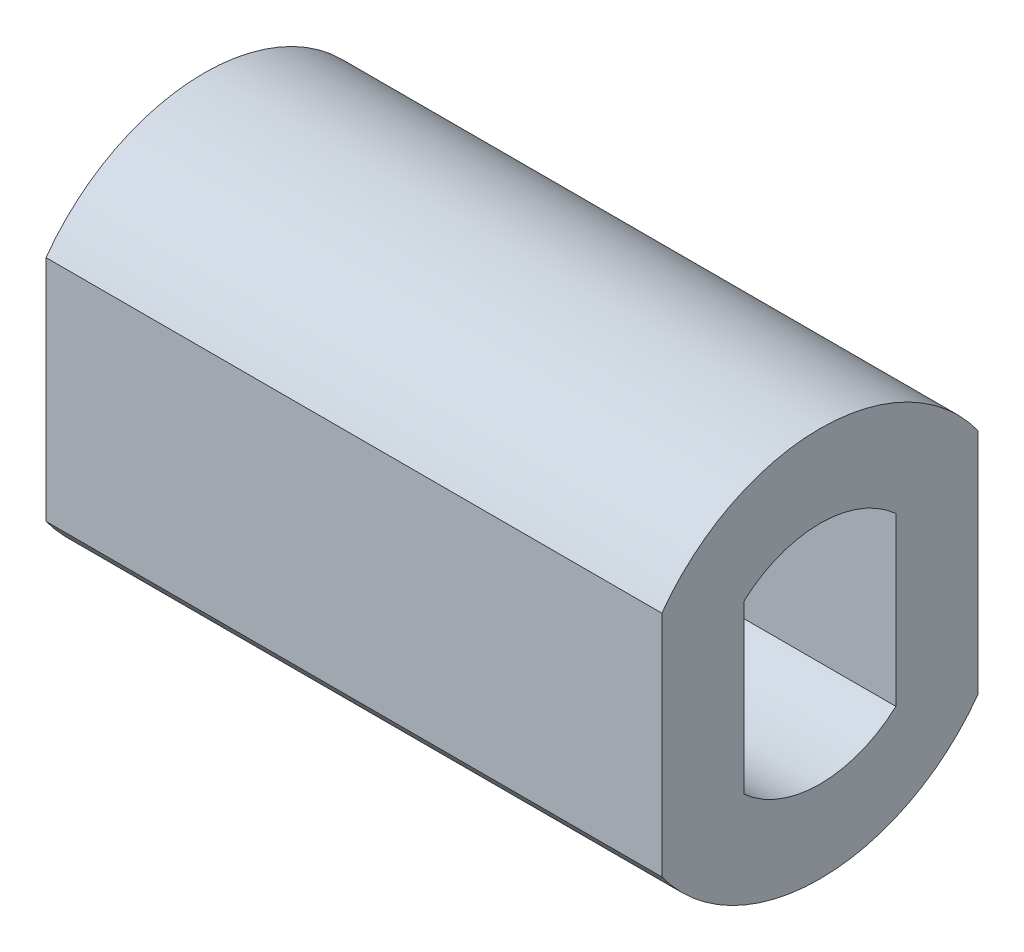
ISO-10303-21;
HEADER;
FILE_DESCRIPTION(('STEP AP214'),'2;1');
FILE_NAME('part.step','',(''),(''),'','','');
FILE_SCHEMA(('AUTOMOTIVE_DESIGN { 1 0 10303 214 1 1 1 1 }'));
ENDSEC;
DATA;
#1=APPLICATION_CONTEXT('core data for automotive mechanical design processes');
#2=APPLICATION_PROTOCOL_DEFINITION('international standard','automotive_design',2000,#1);
#3=PRODUCT_CONTEXT('',#1,'mechanical');
#4=PRODUCT('Part','Part','',(#3));
#5=PRODUCT_RELATED_PRODUCT_CATEGORY('part','',(#4));
#6=PRODUCT_DEFINITION_FORMATION('','',#4);
#7=PRODUCT_DEFINITION_CONTEXT('part definition',#1,'design');
#8=PRODUCT_DEFINITION('design','',#6,#7);
#9=PRODUCT_DEFINITION_SHAPE('','',#8);
#10=(LENGTH_UNIT() NAMED_UNIT(*) SI_UNIT(.MILLI.,.METRE.));
#11=(NAMED_UNIT(*) PLANE_ANGLE_UNIT() SI_UNIT($,.RADIAN.));
#12=(NAMED_UNIT(*) SI_UNIT($,.STERADIAN.) SOLID_ANGLE_UNIT());
#13=UNCERTAINTY_MEASURE_WITH_UNIT(LENGTH_MEASURE(1.E-05),#10,'distance_accuracy_value','');
#14=(GEOMETRIC_REPRESENTATION_CONTEXT(3) GLOBAL_UNCERTAINTY_ASSIGNED_CONTEXT((#13)) GLOBAL_UNIT_ASSIGNED_CONTEXT((#10,
#11,#12)) REPRESENTATION_CONTEXT('',''));
#15=CARTESIAN_POINT('',(0.,0.,0.));
#16=DIRECTION('',(0.,0.,1.));
#17=DIRECTION('',(1.,0.,0.));
#18=AXIS2_PLACEMENT_3D('',#15,#16,#17);
#19=CARTESIAN_POINT('',(20.,0.,0.));
#20=DIRECTION('',(1.,0.,0.));
#21=DIRECTION('',(0.,0.,-1.));
#22=AXIS2_PLACEMENT_3D('',#19,#20,#21);
#23=PLANE('',#22);
#24=CARTESIAN_POINT('',(20.,0.,0.));
#25=DIRECTION('',(1.,0.,0.));
#26=DIRECTION('',(0.,0.,-1.));
#27=AXIS2_PLACEMENT_3D('',#24,#25,#26);
#28=CIRCLE('',#27,4.75);
#29=CARTESIAN_POINT('',(20.,2.78208554864871,-3.85));
#30=VERTEX_POINT('',#29);
#31=CARTESIAN_POINT('',(20.,2.78208554864871,3.85));
#32=VERTEX_POINT('',#31);
#33=EDGE_CURVE('E166',#30,#32,#28,.T.);
#34=ORIENTED_EDGE('',*,*,#33,.T.);
#35=DIRECTION('',(0.,-1.,0.));
#36=VECTOR('',#35,1.);
#37=CARTESIAN_POINT('',(20.,2.78208554864871,3.85));
#38=LINE('',#37,#36);
#39=CARTESIAN_POINT('',(20.,-2.78208554864871,3.85));
#40=VERTEX_POINT('',#39);
#41=EDGE_CURVE('E169',#32,#40,#38,.T.);
#42=ORIENTED_EDGE('',*,*,#41,.T.);
#43=CARTESIAN_POINT('',(20.,0.,0.));
#44=DIRECTION('',(1.,0.,0.));
#45=DIRECTION('',(0.,0.,-1.));
#46=AXIS2_PLACEMENT_3D('',#43,#44,#45);
#47=CIRCLE('',#46,4.75);
#48=CARTESIAN_POINT('',(20.,-2.78208554864871,-3.85));
#49=VERTEX_POINT('',#48);
#50=EDGE_CURVE('E171',#40,#49,#47,.T.);
#51=ORIENTED_EDGE('',*,*,#50,.T.);
#52=DIRECTION('',(0.,1.,0.));
#53=VECTOR('',#52,1.);
#54=CARTESIAN_POINT('',(20.,-2.78208554864871,-3.85));
#55=LINE('',#54,#53);
#56=EDGE_CURVE('E173',#49,#30,#55,.T.);
#57=ORIENTED_EDGE('',*,*,#56,.T.);
#58=EDGE_LOOP('',(#34,#42,#51,#57));
#59=FACE_BOUND('',#58,.T.);
#60=DIRECTION('',(0.,-1.,0.));
#61=VECTOR('',#60,1.);
#62=CARTESIAN_POINT('',(20.,2.03469899493758,1.85));
#63=LINE('',#62,#61);
#64=CARTESIAN_POINT('',(20.,2.03469899493758,1.85));
#65=VERTEX_POINT('',#64);
#66=CARTESIAN_POINT('',(20.,-2.03469899493758,1.85));
#67=VERTEX_POINT('',#66);
#68=EDGE_CURVE('E147',#65,#67,#63,.T.);
#69=ORIENTED_EDGE('',*,*,#68,.F.);
#70=CARTESIAN_POINT('',(20.,0.,0.));
#71=DIRECTION('',(1.,0.,0.));
#72=DIRECTION('',(0.,0.,-1.));
#73=AXIS2_PLACEMENT_3D('',#70,#71,#72);
#74=CIRCLE('',#73,2.75);
#75=CARTESIAN_POINT('',(20.,2.03469899493758,-1.85));
#76=VERTEX_POINT('',#75);
#77=EDGE_CURVE('E119',#76,#65,#74,.T.);
#78=ORIENTED_EDGE('',*,*,#77,.F.);
#79=DIRECTION('',(0.,1.,0.));
#80=VECTOR('',#79,1.);
#81=CARTESIAN_POINT('',(20.,-2.03469899493758,-1.85));
#82=LINE('',#81,#80);
#83=CARTESIAN_POINT('',(20.,-2.03469899493758,-1.85));
#84=VERTEX_POINT('',#83);
#85=EDGE_CURVE('E152',#84,#76,#82,.T.);
#86=ORIENTED_EDGE('',*,*,#85,.F.);
#87=CARTESIAN_POINT('',(20.,0.,0.));
#88=DIRECTION('',(1.,0.,0.));
#89=DIRECTION('',(0.,0.,-1.));
#90=AXIS2_PLACEMENT_3D('',#87,#88,#89);
#91=CIRCLE('',#90,2.75);
#92=EDGE_CURVE('E149',#67,#84,#91,.T.);
#93=ORIENTED_EDGE('',*,*,#92,.F.);
#94=EDGE_LOOP('',(#69,#78,#86,#93));
#95=FACE_BOUND('',#94,.T.);
#96=ADVANCED_FACE('F34',(#59,#95),#23,.T.);
#97=CARTESIAN_POINT('',(20.,0.,0.));
#98=DIRECTION('',(-1.,0.,0.));
#99=DIRECTION('',(0.,0.,1.));
#100=AXIS2_PLACEMENT_3D('',#97,#98,#99);
#101=CYLINDRICAL_SURFACE('',#100,4.75);
#102=DIRECTION('',(-1.,0.,0.));
#103=VECTOR('',#102,1.);
#104=CARTESIAN_POINT('',(20.,2.78208554864871,-3.85));
#105=LINE('',#104,#103);
#106=CARTESIAN_POINT('',(5.,2.78208554864871,-3.85));
#107=VERTEX_POINT('',#106);
#108=EDGE_CURVE('E175',#30,#107,#105,.T.);
#109=ORIENTED_EDGE('',*,*,#108,.T.);
#110=CARTESIAN_POINT('',(5.,0.,0.));
#111=DIRECTION('',(-1.,0.,0.));
#112=DIRECTION('',(0.,0.,1.));
#113=AXIS2_PLACEMENT_3D('',#110,#111,#112);
#114=CIRCLE('',#113,4.75);
#115=CARTESIAN_POINT('',(5.,2.78208554864871,3.85));
#116=VERTEX_POINT('',#115);
#117=EDGE_CURVE('E132',#116,#107,#114,.T.);
#118=ORIENTED_EDGE('',*,*,#117,.F.);
#119=DIRECTION('',(-1.,0.,0.));
#120=VECTOR('',#119,1.);
#121=CARTESIAN_POINT('',(20.,2.78208554864871,3.85));
#122=LINE('',#121,#120);
#123=EDGE_CURVE('E181',#32,#116,#122,.T.);
#124=ORIENTED_EDGE('',*,*,#123,.F.);
#125=ORIENTED_EDGE('',*,*,#33,.F.);
#126=EDGE_LOOP('',(#109,#118,#124,#125));
#127=FACE_BOUND('',#126,.T.);
#128=ADVANCED_FACE('F208',(#127),#101,.T.);
#129=CARTESIAN_POINT('',(20.,2.78208554864871,3.85));
#130=DIRECTION('',(0.,0.,-1.));
#131=DIRECTION('',(0.,1.,0.));
#132=AXIS2_PLACEMENT_3D('',#129,#130,#131);
#133=PLANE('',#132);
#134=ORIENTED_EDGE('',*,*,#123,.T.);
#135=DIRECTION('',(0.,1.,0.));
#136=VECTOR('',#135,1.);
#137=CARTESIAN_POINT('',(5.,0.,3.85));
#138=LINE('',#137,#136);
#139=CARTESIAN_POINT('',(5.,-2.78208554864871,3.85));
#140=VERTEX_POINT('',#139);
#141=EDGE_CURVE('E129',#140,#116,#138,.T.);
#142=ORIENTED_EDGE('',*,*,#141,.F.);
#143=DIRECTION('',(-1.,0.,0.));
#144=VECTOR('',#143,1.);
#145=CARTESIAN_POINT('',(20.,-2.78208554864871,3.85));
#146=LINE('',#145,#144);
#147=EDGE_CURVE('E179',#40,#140,#146,.T.);
#148=ORIENTED_EDGE('',*,*,#147,.F.);
#149=ORIENTED_EDGE('',*,*,#41,.F.);
#150=EDGE_LOOP('',(#134,#142,#148,#149));
#151=FACE_BOUND('',#150,.T.);
#152=ADVANCED_FACE('F214',(#151),#133,.F.);
#153=CARTESIAN_POINT('',(20.,0.,0.));
#154=DIRECTION('',(-1.,0.,0.));
#155=DIRECTION('',(0.,0.,1.));
#156=AXIS2_PLACEMENT_3D('',#153,#154,#155);
#157=CYLINDRICAL_SURFACE('',#156,4.75);
#158=ORIENTED_EDGE('',*,*,#147,.T.);
#159=CARTESIAN_POINT('',(5.,0.,0.));
#160=DIRECTION('',(-1.,0.,0.));
#161=DIRECTION('',(0.,0.,1.));
#162=AXIS2_PLACEMENT_3D('',#159,#160,#161);
#163=CIRCLE('',#162,4.75);
#164=CARTESIAN_POINT('',(5.,-2.78208554864871,-3.85));
#165=VERTEX_POINT('',#164);
#166=EDGE_CURVE('E140',#165,#140,#163,.T.);
#167=ORIENTED_EDGE('',*,*,#166,.F.);
#168=DIRECTION('',(-1.,0.,0.));
#169=VECTOR('',#168,1.);
#170=CARTESIAN_POINT('',(20.,-2.78208554864871,-3.85));
#171=LINE('',#170,#169);
#172=EDGE_CURVE('E177',#49,#165,#171,.T.);
#173=ORIENTED_EDGE('',*,*,#172,.F.);
#174=ORIENTED_EDGE('',*,*,#50,.F.);
#175=EDGE_LOOP('',(#158,#167,#173,#174));
#176=FACE_BOUND('',#175,.T.);
#177=ADVANCED_FACE('F226',(#176),#157,.T.);
#178=CARTESIAN_POINT('',(20.,-2.78208554864871,-3.85));
#179=DIRECTION('',(0.,0.,1.));
#180=DIRECTION('',(1.,0.,0.));
#181=AXIS2_PLACEMENT_3D('',#178,#179,#180);
#182=PLANE('',#181);
#183=ORIENTED_EDGE('',*,*,#172,.T.);
#184=DIRECTION('',(0.,-1.,0.));
#185=VECTOR('',#184,1.);
#186=CARTESIAN_POINT('',(5.,0.,-3.85));
#187=LINE('',#186,#185);
#188=EDGE_CURVE('E137',#107,#165,#187,.T.);
#189=ORIENTED_EDGE('',*,*,#188,.F.);
#190=ORIENTED_EDGE('',*,*,#108,.F.);
#191=ORIENTED_EDGE('',*,*,#56,.F.);
#192=EDGE_LOOP('',(#183,#189,#190,#191));
#193=FACE_BOUND('',#192,.T.);
#194=ADVANCED_FACE('F223',(#193),#182,.F.);
#195=CARTESIAN_POINT('',(20.,0.,0.));
#196=DIRECTION('',(-1.,0.,0.));
#197=DIRECTION('',(0.,0.,1.));
#198=AXIS2_PLACEMENT_3D('',#195,#196,#197);
#199=CYLINDRICAL_SURFACE('',#198,2.75);
#200=DIRECTION('',(-1.,0.,0.));
#201=VECTOR('',#200,1.);
#202=CARTESIAN_POINT('',(20.,2.03469899493758,1.85));
#203=LINE('',#202,#201);
#204=CARTESIAN_POINT('',(11.,2.03469899493758,1.85));
#205=VERTEX_POINT('',#204);
#206=EDGE_CURVE('E163',#65,#205,#203,.T.);
#207=ORIENTED_EDGE('',*,*,#206,.T.);
#208=CARTESIAN_POINT('',(11.,0.,0.));
#209=DIRECTION('',(1.,0.,0.));
#210=DIRECTION('',(0.,0.,-1.));
#211=AXIS2_PLACEMENT_3D('',#208,#209,#210);
#212=CIRCLE('',#211,2.75);
#213=CARTESIAN_POINT('',(11.,2.03469899493758,-1.85));
#214=VERTEX_POINT('',#213);
#215=EDGE_CURVE('E11',#214,#205,#212,.T.);
#216=ORIENTED_EDGE('',*,*,#215,.F.);
#217=DIRECTION('',(-1.,0.,0.));
#218=VECTOR('',#217,1.);
#219=CARTESIAN_POINT('',(20.,2.03469899493758,-1.85));
#220=LINE('',#219,#218);
#221=EDGE_CURVE('E154',#76,#214,#220,.T.);
#222=ORIENTED_EDGE('',*,*,#221,.F.);
#223=ORIENTED_EDGE('',*,*,#77,.T.);
#224=EDGE_LOOP('',(#207,#216,#222,#223));
#225=FACE_BOUND('',#224,.T.);
#226=ADVANCED_FACE('F196',(#225),#199,.F.);
#227=CARTESIAN_POINT('',(20.,2.03469899493758,1.85));
#228=DIRECTION('',(0.,0.,-1.));
#229=DIRECTION('',(-1.,0.,0.));
#230=AXIS2_PLACEMENT_3D('',#227,#228,#229);
#231=PLANE('',#230);
#232=DIRECTION('',(-1.,0.,0.));
#233=VECTOR('',#232,1.);
#234=CARTESIAN_POINT('',(20.,-2.03469899493758,1.85));
#235=LINE('',#234,#233);
#236=CARTESIAN_POINT('',(11.,-2.03469899493758,1.85));
#237=VERTEX_POINT('',#236);
#238=EDGE_CURVE('E160',#67,#237,#235,.T.);
#239=ORIENTED_EDGE('',*,*,#238,.T.);
#240=DIRECTION('',(0.,1.,0.));
#241=VECTOR('',#240,1.);
#242=CARTESIAN_POINT('',(11.,2.03469899493758,1.85));
#243=LINE('',#242,#241);
#244=EDGE_CURVE('E183',#237,#205,#243,.T.);
#245=ORIENTED_EDGE('',*,*,#244,.T.);
#246=ORIENTED_EDGE('',*,*,#206,.F.);
#247=ORIENTED_EDGE('',*,*,#68,.T.);
#248=EDGE_LOOP('',(#239,#245,#246,#247));
#249=FACE_BOUND('',#248,.T.);
#250=ADVANCED_FACE('F199',(#249),#231,.T.);
#251=CARTESIAN_POINT('',(20.,0.,0.));
#252=DIRECTION('',(-1.,0.,0.));
#253=DIRECTION('',(0.,0.,1.));
#254=AXIS2_PLACEMENT_3D('',#251,#252,#253);
#255=CYLINDRICAL_SURFACE('',#254,2.75);
#256=DIRECTION('',(-1.,0.,0.));
#257=VECTOR('',#256,1.);
#258=CARTESIAN_POINT('',(20.,-2.03469899493758,-1.85));
#259=LINE('',#258,#257);
#260=CARTESIAN_POINT('',(11.,-2.03469899493758,-1.85));
#261=VERTEX_POINT('',#260);
#262=EDGE_CURVE('E157',#84,#261,#259,.T.);
#263=ORIENTED_EDGE('',*,*,#262,.T.);
#264=EDGE_CURVE('E42',#237,#261,#212,.T.);
#265=ORIENTED_EDGE('',*,*,#264,.F.);
#266=ORIENTED_EDGE('',*,*,#238,.F.);
#267=ORIENTED_EDGE('',*,*,#92,.T.);
#268=EDGE_LOOP('',(#263,#265,#266,#267));
#269=FACE_BOUND('',#268,.T.);
#270=ADVANCED_FACE('F188',(#269),#255,.F.);
#271=CARTESIAN_POINT('',(20.,-2.03469899493758,-1.85));
#272=DIRECTION('',(0.,0.,1.));
#273=DIRECTION('',(1.,0.,0.));
#274=AXIS2_PLACEMENT_3D('',#271,#272,#273);
#275=PLANE('',#274);
#276=ORIENTED_EDGE('',*,*,#221,.T.);
#277=DIRECTION('',(0.,-1.,0.));
#278=VECTOR('',#277,1.);
#279=CARTESIAN_POINT('',(11.,2.03469899493758,-1.85));
#280=LINE('',#279,#278);
#281=EDGE_CURVE('E64',#214,#261,#280,.T.);
#282=ORIENTED_EDGE('',*,*,#281,.T.);
#283=ORIENTED_EDGE('',*,*,#262,.F.);
#284=ORIENTED_EDGE('',*,*,#85,.T.);
#285=EDGE_LOOP('',(#276,#282,#283,#284));
#286=FACE_BOUND('',#285,.T.);
#287=ADVANCED_FACE('F185',(#286),#275,.T.);
#288=CARTESIAN_POINT('',(11.,0.,0.));
#289=DIRECTION('',(1.,0.,0.));
#290=DIRECTION('',(0.,0.,-1.));
#291=AXIS2_PLACEMENT_3D('',#288,#289,#290);
#292=PLANE('',#291);
#293=ORIENTED_EDGE('',*,*,#244,.F.);
#294=ORIENTED_EDGE('',*,*,#264,.T.);
#295=ORIENTED_EDGE('',*,*,#281,.F.);
#296=ORIENTED_EDGE('',*,*,#215,.T.);
#297=EDGE_LOOP('',(#293,#294,#295,#296));
#298=FACE_BOUND('',#297,.T.);
#299=ADVANCED_FACE('F36',(#298),#292,.T.);
#300=CARTESIAN_POINT('',(5.,0.,0.));
#301=DIRECTION('',(1.,0.,0.));
#302=DIRECTION('',(0.,0.,-1.));
#303=AXIS2_PLACEMENT_3D('',#300,#301,#302);
#304=CYLINDRICAL_SURFACE('',#303,3.2);
#305=CARTESIAN_POINT('',(10.,0.,0.));
#306=DIRECTION('',(-1.,0.,0.));
#307=DIRECTION('',(0.,0.,1.));
#308=AXIS2_PLACEMENT_3D('',#305,#306,#307);
#309=CIRCLE('',#308,3.2);
#310=CARTESIAN_POINT('',(10.,-2.87749891398763,-1.4));
#311=VERTEX_POINT('',#310);
#312=CARTESIAN_POINT('',(10.,2.87749891398763,-1.4));
#313=VERTEX_POINT('',#312);
#314=EDGE_CURVE('E49',#311,#313,#309,.T.);
#315=ORIENTED_EDGE('',*,*,#314,.F.);
#316=DIRECTION('',(1.,0.,0.));
#317=VECTOR('',#316,1.);
#318=CARTESIAN_POINT('',(5.,-2.87749891398763,-1.4));
#319=LINE('',#318,#317);
#320=CARTESIAN_POINT('',(5.,-2.87749891398763,-1.4));
#321=VERTEX_POINT('',#320);
#322=EDGE_CURVE('E110',#321,#311,#319,.T.);
#323=ORIENTED_EDGE('',*,*,#322,.F.);
#324=CARTESIAN_POINT('',(5.,0.,0.));
#325=DIRECTION('',(-1.,0.,0.));
#326=DIRECTION('',(0.,0.,1.));
#327=AXIS2_PLACEMENT_3D('',#324,#325,#326);
#328=CIRCLE('',#327,3.2);
#329=CARTESIAN_POINT('',(5.,2.87749891398763,-1.4));
#330=VERTEX_POINT('',#329);
#331=EDGE_CURVE('E113',#321,#330,#328,.T.);
#332=ORIENTED_EDGE('',*,*,#331,.T.);
#333=DIRECTION('',(1.,0.,0.));
#334=VECTOR('',#333,1.);
#335=CARTESIAN_POINT('',(5.,2.87749891398763,-1.4));
#336=LINE('',#335,#334);
#337=EDGE_CURVE('E120',#330,#313,#336,.T.);
#338=ORIENTED_EDGE('',*,*,#337,.T.);
#339=EDGE_LOOP('',(#315,#323,#332,#338));
#340=FACE_BOUND('',#339,.T.);
#341=ADVANCED_FACE('F112',(#340),#304,.F.);
#342=CARTESIAN_POINT('',(5.,0.,-1.4));
#343=DIRECTION('',(0.,0.,1.));
#344=DIRECTION('',(1.,0.,0.));
#345=AXIS2_PLACEMENT_3D('',#342,#343,#344);
#346=PLANE('',#345);
#347=DIRECTION('',(0.,-1.,0.));
#348=VECTOR('',#347,1.);
#349=CARTESIAN_POINT('',(10.,0.,-1.4));
#350=LINE('',#349,#348);
#351=EDGE_CURVE('E126',#313,#311,#350,.T.);
#352=ORIENTED_EDGE('',*,*,#351,.F.);
#353=ORIENTED_EDGE('',*,*,#337,.F.);
#354=DIRECTION('',(0.,-1.,0.));
#355=VECTOR('',#354,1.);
#356=CARTESIAN_POINT('',(5.,0.,-1.4));
#357=LINE('',#356,#355);
#358=EDGE_CURVE('E125',#330,#321,#357,.T.);
#359=ORIENTED_EDGE('',*,*,#358,.T.);
#360=ORIENTED_EDGE('',*,*,#322,.T.);
#361=EDGE_LOOP('',(#352,#353,#359,#360));
#362=FACE_BOUND('',#361,.T.);
#363=ADVANCED_FACE('F128',(#362),#346,.T.);
#364=CARTESIAN_POINT('',(5.,0.,0.));
#365=DIRECTION('',(-1.,0.,0.));
#366=DIRECTION('',(0.,0.,1.));
#367=AXIS2_PLACEMENT_3D('',#364,#365,#366);
#368=PLANE('',#367);
#369=ORIENTED_EDGE('',*,*,#331,.F.);
#370=ORIENTED_EDGE('',*,*,#358,.F.);
#371=EDGE_LOOP('',(#369,#370));
#372=FACE_BOUND('',#371,.T.);
#373=ORIENTED_EDGE('',*,*,#141,.T.);
#374=ORIENTED_EDGE('',*,*,#117,.T.);
#375=ORIENTED_EDGE('',*,*,#188,.T.);
#376=ORIENTED_EDGE('',*,*,#166,.T.);
#377=EDGE_LOOP('',(#373,#374,#375,#376));
#378=FACE_BOUND('',#377,.T.);
#379=ADVANCED_FACE('F123',(#372,#378),#368,.T.);
#380=CARTESIAN_POINT('',(10.,0.,0.));
#381=DIRECTION('',(1.,0.,0.));
#382=DIRECTION('',(0.,0.,-1.));
#383=AXIS2_PLACEMENT_3D('',#380,#381,#382);
#384=PLANE('',#383);
#385=ORIENTED_EDGE('',*,*,#351,.T.);
#386=ORIENTED_EDGE('',*,*,#314,.T.);
#387=EDGE_LOOP('',(#385,#386));
#388=FACE_BOUND('',#387,.T.);
#389=ADVANCED_FACE('F219',(#388),#384,.F.);
#390=CLOSED_SHELL('',(#96,#128,#152,#177,#194,#226,#250,#270,#287,#299,#341,#363,#379,#389));
#391=MANIFOLD_SOLID_BREP('B2',#390);
#392=ADVANCED_BREP_SHAPE_REPRESENTATION('',(#18,#391),#14);
#393=SHAPE_DEFINITION_REPRESENTATION(#9,#392);
ENDSEC;
END-ISO-10303-21;
